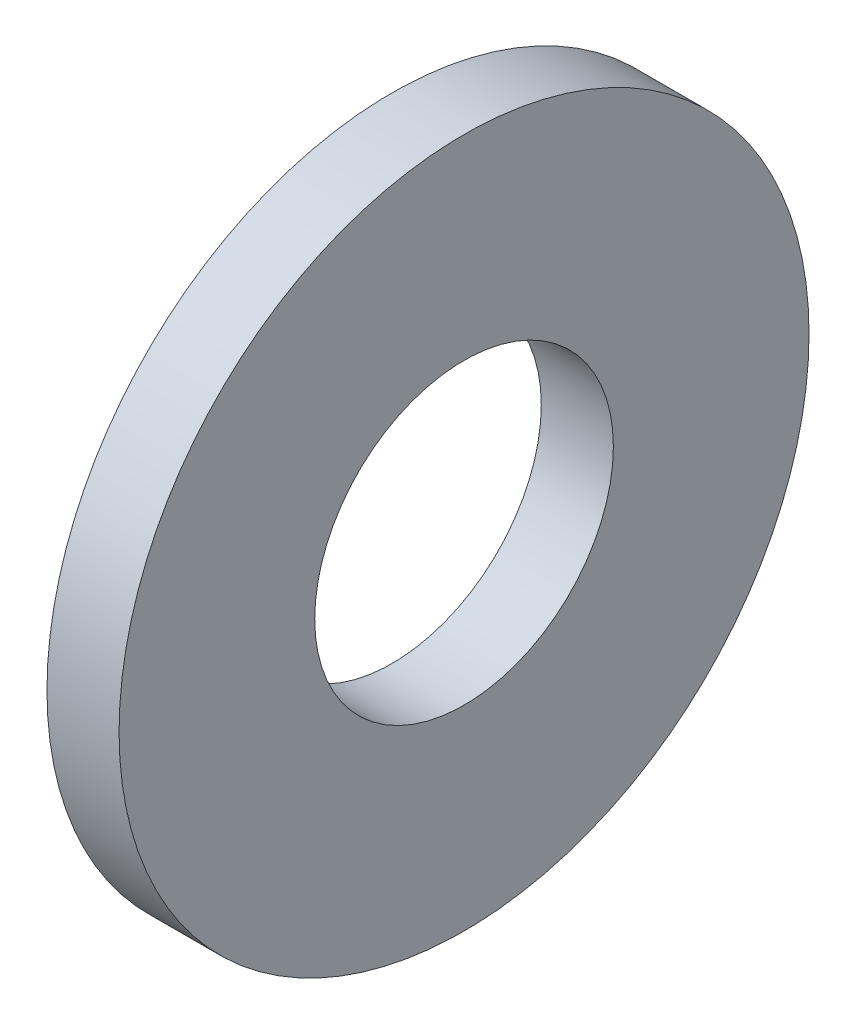
ISO-10303-21;
HEADER;
FILE_DESCRIPTION(('STEP AP214'),'2;1');
FILE_NAME('part.step','',(''),(''),'','','');
FILE_SCHEMA(('AUTOMOTIVE_DESIGN { 1 0 10303 214 1 1 1 1 }'));
ENDSEC;
DATA;
#1=APPLICATION_CONTEXT('core data for automotive mechanical design processes');
#2=APPLICATION_PROTOCOL_DEFINITION('international standard','automotive_design',2000,#1);
#3=PRODUCT_CONTEXT('',#1,'mechanical');
#4=PRODUCT('Part','Part','',(#3));
#5=PRODUCT_RELATED_PRODUCT_CATEGORY('part','',(#4));
#6=PRODUCT_DEFINITION_FORMATION('','',#4);
#7=PRODUCT_DEFINITION_CONTEXT('part definition',#1,'design');
#8=PRODUCT_DEFINITION('design','',#6,#7);
#9=PRODUCT_DEFINITION_SHAPE('','',#8);
#10=(LENGTH_UNIT() NAMED_UNIT(*) SI_UNIT(.MILLI.,.METRE.));
#11=(NAMED_UNIT(*) PLANE_ANGLE_UNIT() SI_UNIT($,.RADIAN.));
#12=(NAMED_UNIT(*) SI_UNIT($,.STERADIAN.) SOLID_ANGLE_UNIT());
#13=UNCERTAINTY_MEASURE_WITH_UNIT(LENGTH_MEASURE(1.E-05),#10,'distance_accuracy_value','');
#14=(GEOMETRIC_REPRESENTATION_CONTEXT(3) GLOBAL_UNCERTAINTY_ASSIGNED_CONTEXT((#13)) GLOBAL_UNIT_ASSIGNED_CONTEXT((#10,
#11,#12)) REPRESENTATION_CONTEXT('',''));
#15=CARTESIAN_POINT('',(0.,0.,0.));
#16=DIRECTION('',(0.,0.,1.));
#17=DIRECTION('',(1.,0.,0.));
#18=AXIS2_PLACEMENT_3D('',#15,#16,#17);
#19=CARTESIAN_POINT('',(-34.9249999999999,0.,0.));
#20=DIRECTION('',(-1.,0.,0.));
#21=DIRECTION('',(0.,0.,1.));
#22=AXIS2_PLACEMENT_3D('',#19,#20,#21);
#23=CYLINDRICAL_SURFACE('',#22,2.5781);
#24=CARTESIAN_POINT('',(0.,0.,0.));
#25=DIRECTION('',(-1.,0.,0.));
#26=DIRECTION('',(0.,0.,1.));
#27=AXIS2_PLACEMENT_3D('',#24,#25,#26);
#28=CIRCLE('',#27,2.5781);
#29=CARTESIAN_POINT('',(0.,0.,2.5781));
#30=VERTEX_POINT('',#29);
#31=EDGE_CURVE('E10',#30,#30,#28,.T.);
#32=ORIENTED_EDGE('',*,*,#31,.F.);
#33=EDGE_LOOP('',(#32));
#34=FACE_BOUND('',#33,.T.);
#35=CARTESIAN_POINT('',(-1.2446,0.,0.));
#36=DIRECTION('',(-1.,0.,0.));
#37=DIRECTION('',(0.,0.,1.));
#38=AXIS2_PLACEMENT_3D('',#35,#36,#37);
#39=CIRCLE('',#38,2.5781);
#40=CARTESIAN_POINT('',(-1.2446,0.,2.5781));
#41=VERTEX_POINT('',#40);
#42=EDGE_CURVE('E45',#41,#41,#39,.T.);
#43=ORIENTED_EDGE('',*,*,#42,.T.);
#44=EDGE_LOOP('',(#43));
#45=FACE_BOUND('',#44,.T.);
#46=ADVANCED_FACE('F31',(#34,#45),#23,.F.);
#47=CARTESIAN_POINT('',(0.,2.5781,0.));
#48=DIRECTION('',(-1.,0.,0.));
#49=DIRECTION('',(0.,0.,1.));
#50=AXIS2_PLACEMENT_3D('',#47,#48,#49);
#51=PLANE('',#50);
#52=CARTESIAN_POINT('',(0.,0.,0.));
#53=DIRECTION('',(-1.,0.,0.));
#54=DIRECTION('',(0.,0.,1.));
#55=AXIS2_PLACEMENT_3D('',#52,#53,#54);
#56=CIRCLE('',#55,5.9563);
#57=CARTESIAN_POINT('',(0.,0.,5.9563));
#58=VERTEX_POINT('',#57);
#59=EDGE_CURVE('E37',#58,#58,#56,.T.);
#60=ORIENTED_EDGE('',*,*,#59,.F.);
#61=EDGE_LOOP('',(#60));
#62=FACE_BOUND('',#61,.T.);
#63=ORIENTED_EDGE('',*,*,#31,.T.);
#64=EDGE_LOOP('',(#63));
#65=FACE_BOUND('',#64,.T.);
#66=ADVANCED_FACE('F60',(#62,#65),#51,.F.);
#67=CARTESIAN_POINT('',(-34.9249999999999,0.,0.));
#68=DIRECTION('',(-1.,0.,0.));
#69=DIRECTION('',(0.,0.,1.));
#70=AXIS2_PLACEMENT_3D('',#67,#68,#69);
#71=CYLINDRICAL_SURFACE('',#70,5.9563);
#72=CARTESIAN_POINT('',(-1.2446,0.,0.));
#73=DIRECTION('',(-1.,0.,0.));
#74=DIRECTION('',(0.,0.,1.));
#75=AXIS2_PLACEMENT_3D('',#72,#73,#74);
#76=CIRCLE('',#75,5.9563);
#77=CARTESIAN_POINT('',(-1.2446,0.,5.9563));
#78=VERTEX_POINT('',#77);
#79=EDGE_CURVE('E41',#78,#78,#76,.T.);
#80=ORIENTED_EDGE('',*,*,#79,.F.);
#81=EDGE_LOOP('',(#80));
#82=FACE_BOUND('',#81,.T.);
#83=ORIENTED_EDGE('',*,*,#59,.T.);
#84=EDGE_LOOP('',(#83));
#85=FACE_BOUND('',#84,.T.);
#86=ADVANCED_FACE('F55',(#82,#85),#71,.T.);
#87=CARTESIAN_POINT('',(-1.2446,5.9563,0.));
#88=DIRECTION('',(1.,0.,0.));
#89=DIRECTION('',(0.,0.,-1.));
#90=AXIS2_PLACEMENT_3D('',#87,#88,#89);
#91=PLANE('',#90);
#92=ORIENTED_EDGE('',*,*,#42,.F.);
#93=EDGE_LOOP('',(#92));
#94=FACE_BOUND('',#93,.T.);
#95=ORIENTED_EDGE('',*,*,#79,.T.);
#96=EDGE_LOOP('',(#95));
#97=FACE_BOUND('',#96,.T.);
#98=ADVANCED_FACE('F52',(#94,#97),#91,.F.);
#99=CLOSED_SHELL('',(#46,#66,#86,#98));
#100=MANIFOLD_SOLID_BREP('B2',#99);
#101=ADVANCED_BREP_SHAPE_REPRESENTATION('',(#18,#100),#14);
#102=SHAPE_DEFINITION_REPRESENTATION(#9,#101);
ENDSEC;
END-ISO-10303-21;
